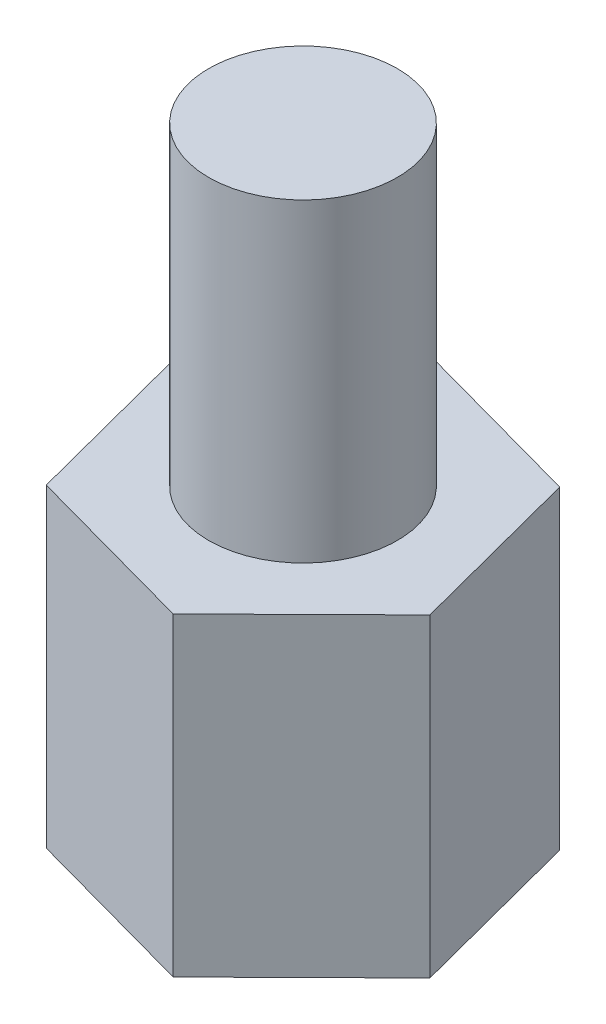
ISO-10303-21;
HEADER;
FILE_DESCRIPTION(('STEP AP214'),'2;1');
FILE_NAME('part.step','',(''),(''),'','','');
FILE_SCHEMA(('AUTOMOTIVE_DESIGN { 1 0 10303 214 1 1 1 1 }'));
ENDSEC;
DATA;
#1=APPLICATION_CONTEXT('core data for automotive mechanical design processes');
#2=APPLICATION_PROTOCOL_DEFINITION('international standard','automotive_design',2000,#1);
#3=PRODUCT_CONTEXT('',#1,'mechanical');
#4=PRODUCT('Part','Part','',(#3));
#5=PRODUCT_RELATED_PRODUCT_CATEGORY('part','',(#4));
#6=PRODUCT_DEFINITION_FORMATION('','',#4);
#7=PRODUCT_DEFINITION_CONTEXT('part definition',#1,'design');
#8=PRODUCT_DEFINITION('design','',#6,#7);
#9=PRODUCT_DEFINITION_SHAPE('','',#8);
#10=(LENGTH_UNIT() NAMED_UNIT(*) SI_UNIT(.MILLI.,.METRE.));
#11=(NAMED_UNIT(*) PLANE_ANGLE_UNIT() SI_UNIT($,.RADIAN.));
#12=(NAMED_UNIT(*) SI_UNIT($,.STERADIAN.) SOLID_ANGLE_UNIT());
#13=UNCERTAINTY_MEASURE_WITH_UNIT(LENGTH_MEASURE(1.E-05),#10,'distance_accuracy_value','');
#14=(GEOMETRIC_REPRESENTATION_CONTEXT(3) GLOBAL_UNCERTAINTY_ASSIGNED_CONTEXT((#13)) GLOBAL_UNIT_ASSIGNED_CONTEXT((#10,
#11,#12)) REPRESENTATION_CONTEXT('',''));
#15=CARTESIAN_POINT('',(0.,0.,0.));
#16=DIRECTION('',(0.,0.,1.));
#17=DIRECTION('',(1.,0.,0.));
#18=AXIS2_PLACEMENT_3D('',#15,#16,#17);
#19=CARTESIAN_POINT('',(-2.05470355532415,5.,2.02768997459466));
#20=DIRECTION('',(0.265204860797644,0.,-0.964192087609778));
#21=DIRECTION('',(-0.964192087609778,0.,-0.265204860797644));
#22=AXIS2_PLACEMENT_3D('',#19,#20,#21);
#23=PLANE('',#22);
#24=DIRECTION('',(0.964192087609778,0.,0.265204860797644));
#25=VECTOR('',#24,1.);
#26=CARTESIAN_POINT('',(-2.05470355532415,0.,2.02768997459466));
#27=LINE('',#26,#25);
#28=CARTESIAN_POINT('',(-2.05470355532415,0.,2.02768997459466));
#29=VERTEX_POINT('',#28);
#30=CARTESIAN_POINT('',(0.728679251335923,0.,2.79327046345425));
#31=VERTEX_POINT('',#30);
#32=EDGE_CURVE('E131',#29,#31,#27,.T.);
#33=ORIENTED_EDGE('',*,*,#32,.T.);
#34=DIRECTION('',(0.,-1.,0.));
#35=VECTOR('',#34,1.);
#36=CARTESIAN_POINT('',(0.728679251335923,5.,2.79327046345425));
#37=LINE('',#36,#35);
#38=CARTESIAN_POINT('',(0.728679251335923,5.,2.79327046345425));
#39=VERTEX_POINT('',#38);
#40=EDGE_CURVE('E115',#39,#31,#37,.T.);
#41=ORIENTED_EDGE('',*,*,#40,.F.);
#42=DIRECTION('',(0.964192087609778,0.,0.265204860797644));
#43=VECTOR('',#42,1.);
#44=CARTESIAN_POINT('',(-2.05470355532415,5.,2.02768997459466));
#45=LINE('',#44,#43);
#46=CARTESIAN_POINT('',(-2.05470355532415,5.,2.02768997459466));
#47=VERTEX_POINT('',#46);
#48=EDGE_CURVE('E140',#47,#39,#45,.T.);
#49=ORIENTED_EDGE('',*,*,#48,.F.);
#50=DIRECTION('',(0.,-1.,0.));
#51=VECTOR('',#50,1.);
#52=CARTESIAN_POINT('',(-2.05470355532415,5.,2.02768997459466));
#53=LINE('',#52,#51);
#54=EDGE_CURVE('E117',#47,#29,#53,.T.);
#55=ORIENTED_EDGE('',*,*,#54,.T.);
#56=EDGE_LOOP('',(#33,#41,#49,#55));
#57=FACE_BOUND('',#56,.T.);
#58=ADVANCED_FACE('F47',(#57),#23,.F.);
#59=CARTESIAN_POINT('',(0.728679251335923,5.,2.79327046345425));
#60=DIRECTION('',(-0.702412411599197,0.,-0.711770190462764));
#61=DIRECTION('',(-0.711770190462764,0.,0.702412411599197));
#62=AXIS2_PLACEMENT_3D('',#59,#60,#61);
#63=PLANE('',#62);
#64=DIRECTION('',(0.711770190462764,0.,-0.702412411599197));
#65=VECTOR('',#64,1.);
#66=CARTESIAN_POINT('',(0.728679251335923,0.,2.79327046345425));
#67=LINE('',#66,#65);
#68=CARTESIAN_POINT('',(2.78338280666007,0.,0.765580488859587));
#69=VERTEX_POINT('',#68);
#70=EDGE_CURVE('E65',#31,#69,#67,.T.);
#71=ORIENTED_EDGE('',*,*,#70,.T.);
#72=DIRECTION('',(0.,-1.,0.));
#73=VECTOR('',#72,1.);
#74=CARTESIAN_POINT('',(2.78338280666007,5.,0.765580488859587));
#75=LINE('',#74,#73);
#76=CARTESIAN_POINT('',(2.78338280666007,5.,0.765580488859587));
#77=VERTEX_POINT('',#76);
#78=EDGE_CURVE('E112',#77,#69,#75,.T.);
#79=ORIENTED_EDGE('',*,*,#78,.F.);
#80=DIRECTION('',(0.711770190462764,0.,-0.702412411599197));
#81=VECTOR('',#80,1.);
#82=CARTESIAN_POINT('',(0.728679251335923,5.,2.79327046345425));
#83=LINE('',#82,#81);
#84=EDGE_CURVE('E87',#39,#77,#83,.T.);
#85=ORIENTED_EDGE('',*,*,#84,.F.);
#86=ORIENTED_EDGE('',*,*,#40,.T.);
#87=EDGE_LOOP('',(#71,#79,#85,#86));
#88=FACE_BOUND('',#87,.T.);
#89=ADVANCED_FACE('F111',(#88),#63,.F.);
#90=CARTESIAN_POINT('',(2.78338280666007,5.,0.765580488859587));
#91=DIRECTION('',(-0.967617272396841,0.,0.252421897147014));
#92=DIRECTION('',(0.252421897147014,0.,0.967617272396841));
#93=AXIS2_PLACEMENT_3D('',#90,#91,#92);
#94=PLANE('',#93);
#95=DIRECTION('',(-0.252421897147014,0.,-0.967617272396841));
#96=VECTOR('',#95,1.);
#97=CARTESIAN_POINT('',(2.78338280666007,0.,0.765580488859587));
#98=LINE('',#97,#96);
#99=CARTESIAN_POINT('',(2.05470355532415,0.,-2.02768997459466));
#100=VERTEX_POINT('',#99);
#101=EDGE_CURVE('E108',#69,#100,#98,.T.);
#102=ORIENTED_EDGE('',*,*,#101,.T.);
#103=DIRECTION('',(0.,-1.,0.));
#104=VECTOR('',#103,1.);
#105=CARTESIAN_POINT('',(2.05470355532415,5.,-2.02768997459466));
#106=LINE('',#105,#104);
#107=CARTESIAN_POINT('',(2.05470355532415,5.,-2.02768997459466));
#108=VERTEX_POINT('',#107);
#109=EDGE_CURVE('E155',#108,#100,#106,.T.);
#110=ORIENTED_EDGE('',*,*,#109,.F.);
#111=DIRECTION('',(-0.252421897147014,0.,-0.967617272396841));
#112=VECTOR('',#111,1.);
#113=CARTESIAN_POINT('',(2.78338280666007,5.,0.765580488859587));
#114=LINE('',#113,#112);
#115=EDGE_CURVE('E120',#77,#108,#114,.T.);
#116=ORIENTED_EDGE('',*,*,#115,.F.);
#117=ORIENTED_EDGE('',*,*,#78,.T.);
#118=EDGE_LOOP('',(#102,#110,#116,#117));
#119=FACE_BOUND('',#118,.T.);
#120=ADVANCED_FACE('F119',(#119),#94,.F.);
#121=CARTESIAN_POINT('',(2.05470355532415,5.,-2.02768997459466));
#122=DIRECTION('',(-0.265204860797644,0.,0.964192087609778));
#123=DIRECTION('',(0.964192087609778,0.,0.265204860797644));
#124=AXIS2_PLACEMENT_3D('',#121,#122,#123);
#125=PLANE('',#124);
#126=DIRECTION('',(-0.964192087609778,0.,-0.265204860797644));
#127=VECTOR('',#126,1.);
#128=CARTESIAN_POINT('',(2.05470355532415,0.,-2.02768997459466));
#129=LINE('',#128,#127);
#130=CARTESIAN_POINT('',(-0.728679251335924,0.,-2.79327046345425));
#131=VERTEX_POINT('',#130);
#132=EDGE_CURVE('E121',#100,#131,#129,.T.);
#133=ORIENTED_EDGE('',*,*,#132,.T.);
#134=DIRECTION('',(0.,-1.,0.));
#135=VECTOR('',#134,1.);
#136=CARTESIAN_POINT('',(-0.728679251335924,5.,-2.79327046345425));
#137=LINE('',#136,#135);
#138=CARTESIAN_POINT('',(-0.728679251335924,5.,-2.79327046345425));
#139=VERTEX_POINT('',#138);
#140=EDGE_CURVE('E149',#139,#131,#137,.T.);
#141=ORIENTED_EDGE('',*,*,#140,.F.);
#142=DIRECTION('',(-0.964192087609778,0.,-0.265204860797644));
#143=VECTOR('',#142,1.);
#144=CARTESIAN_POINT('',(2.05470355532415,5.,-2.02768997459466));
#145=LINE('',#144,#143);
#146=EDGE_CURVE('E136',#108,#139,#145,.T.);
#147=ORIENTED_EDGE('',*,*,#146,.F.);
#148=ORIENTED_EDGE('',*,*,#109,.T.);
#149=EDGE_LOOP('',(#133,#141,#147,#148));
#150=FACE_BOUND('',#149,.T.);
#151=ADVANCED_FACE('F161',(#150),#125,.F.);
#152=CARTESIAN_POINT('',(-0.728679251335924,5.,-2.79327046345425));
#153=DIRECTION('',(0.702412411599197,0.,0.711770190462765));
#154=DIRECTION('',(0.711770190462765,0.,-0.702412411599197));
#155=AXIS2_PLACEMENT_3D('',#152,#153,#154);
#156=PLANE('',#155);
#157=DIRECTION('',(-0.711770190462765,0.,0.702412411599197));
#158=VECTOR('',#157,1.);
#159=CARTESIAN_POINT('',(-0.728679251335924,0.,-2.79327046345425));
#160=LINE('',#159,#158);
#161=CARTESIAN_POINT('',(-2.78338280666007,0.,-0.765580488859588));
#162=VERTEX_POINT('',#161);
#163=EDGE_CURVE('E154',#131,#162,#160,.T.);
#164=ORIENTED_EDGE('',*,*,#163,.T.);
#165=DIRECTION('',(0.,-1.,0.));
#166=VECTOR('',#165,1.);
#167=CARTESIAN_POINT('',(-2.78338280666007,5.,-0.765580488859588));
#168=LINE('',#167,#166);
#169=CARTESIAN_POINT('',(-2.78338280666007,5.,-0.765580488859588));
#170=VERTEX_POINT('',#169);
#171=EDGE_CURVE('E143',#170,#162,#168,.T.);
#172=ORIENTED_EDGE('',*,*,#171,.F.);
#173=DIRECTION('',(-0.711770190462765,0.,0.702412411599197));
#174=VECTOR('',#173,1.);
#175=CARTESIAN_POINT('',(-0.728679251335924,5.,-2.79327046345425));
#176=LINE('',#175,#174);
#177=EDGE_CURVE('E134',#139,#170,#176,.T.);
#178=ORIENTED_EDGE('',*,*,#177,.F.);
#179=ORIENTED_EDGE('',*,*,#140,.T.);
#180=EDGE_LOOP('',(#164,#172,#178,#179));
#181=FACE_BOUND('',#180,.T.);
#182=ADVANCED_FACE('F163',(#181),#156,.F.);
#183=CARTESIAN_POINT('',(-2.78338280666007,5.,-0.765580488859588));
#184=DIRECTION('',(0.967617272396841,0.,-0.252421897147014));
#185=DIRECTION('',(-0.252421897147014,0.,-0.967617272396841));
#186=AXIS2_PLACEMENT_3D('',#183,#184,#185);
#187=PLANE('',#186);
#188=DIRECTION('',(0.252421897147014,0.,0.967617272396841));
#189=VECTOR('',#188,1.);
#190=CARTESIAN_POINT('',(-2.78338280666007,0.,-0.765580488859588));
#191=LINE('',#190,#189);
#192=EDGE_CURVE('E96',#162,#29,#191,.T.);
#193=ORIENTED_EDGE('',*,*,#192,.T.);
#194=ORIENTED_EDGE('',*,*,#54,.F.);
#195=DIRECTION('',(0.252421897147014,0.,0.967617272396841));
#196=VECTOR('',#195,1.);
#197=CARTESIAN_POINT('',(-2.78338280666007,5.,-0.765580488859588));
#198=LINE('',#197,#196);
#199=EDGE_CURVE('E57',#170,#47,#198,.T.);
#200=ORIENTED_EDGE('',*,*,#199,.F.);
#201=ORIENTED_EDGE('',*,*,#171,.T.);
#202=EDGE_LOOP('',(#193,#194,#200,#201));
#203=FACE_BOUND('',#202,.T.);
#204=ADVANCED_FACE('F165',(#203),#187,.F.);
#205=CARTESIAN_POINT('',(0.,5.,0.));
#206=DIRECTION('',(0.,1.,0.));
#207=DIRECTION('',(0.,0.,1.));
#208=AXIS2_PLACEMENT_3D('',#205,#206,#207);
#209=PLANE('',#208);
#210=CARTESIAN_POINT('',(0.,5.,0.));
#211=DIRECTION('',(0.,-1.,0.));
#212=DIRECTION('',(0.,0.,-1.));
#213=AXIS2_PLACEMENT_3D('',#210,#211,#212);
#214=CIRCLE('',#213,1.5);
#215=CARTESIAN_POINT('',(0.,5.,-1.5));
#216=VERTEX_POINT('',#215);
#217=EDGE_CURVE('E51',#216,#216,#214,.T.);
#218=ORIENTED_EDGE('',*,*,#217,.T.);
#219=EDGE_LOOP('',(#218));
#220=FACE_BOUND('',#219,.T.);
#221=ORIENTED_EDGE('',*,*,#48,.T.);
#222=ORIENTED_EDGE('',*,*,#84,.T.);
#223=ORIENTED_EDGE('',*,*,#115,.T.);
#224=ORIENTED_EDGE('',*,*,#146,.T.);
#225=ORIENTED_EDGE('',*,*,#177,.T.);
#226=ORIENTED_EDGE('',*,*,#199,.T.);
#227=EDGE_LOOP('',(#221,#222,#223,#224,#225,#226));
#228=FACE_BOUND('',#227,.T.);
#229=ADVANCED_FACE('F166',(#220,#228),#209,.T.);
#230=CARTESIAN_POINT('',(0.,0.,0.));
#231=DIRECTION('',(0.,1.,0.));
#232=DIRECTION('',(0.,0.,1.));
#233=AXIS2_PLACEMENT_3D('',#230,#231,#232);
#234=PLANE('',#233);
#235=CARTESIAN_POINT('',(0.,0.,0.));
#236=DIRECTION('',(0.,-1.,0.));
#237=DIRECTION('',(0.,0.,-1.));
#238=AXIS2_PLACEMENT_3D('',#235,#236,#237);
#239=CIRCLE('',#238,1.5);
#240=CARTESIAN_POINT('',(0.,0.,-1.5));
#241=VERTEX_POINT('',#240);
#242=EDGE_CURVE('E12',#241,#241,#239,.T.);
#243=ORIENTED_EDGE('',*,*,#242,.F.);
#244=EDGE_LOOP('',(#243));
#245=FACE_BOUND('',#244,.T.);
#246=ORIENTED_EDGE('',*,*,#32,.F.);
#247=ORIENTED_EDGE('',*,*,#192,.F.);
#248=ORIENTED_EDGE('',*,*,#163,.F.);
#249=ORIENTED_EDGE('',*,*,#132,.F.);
#250=ORIENTED_EDGE('',*,*,#101,.F.);
#251=ORIENTED_EDGE('',*,*,#70,.F.);
#252=EDGE_LOOP('',(#246,#247,#248,#249,#250,#251));
#253=FACE_BOUND('',#252,.T.);
#254=ADVANCED_FACE('F124',(#245,#253),#234,.F.);
#255=CARTESIAN_POINT('',(0.,5.,0.));
#256=DIRECTION('',(0.,-1.,0.));
#257=DIRECTION('',(0.,0.,-1.));
#258=AXIS2_PLACEMENT_3D('',#255,#256,#257);
#259=CYLINDRICAL_SURFACE('',#258,1.5);
#260=ORIENTED_EDGE('',*,*,#217,.F.);
#261=EDGE_LOOP('',(#260));
#262=FACE_BOUND('',#261,.T.);
#263=ORIENTED_EDGE('',*,*,#242,.T.);
#264=EDGE_LOOP('',(#263));
#265=FACE_BOUND('',#264,.T.);
#266=ADVANCED_FACE('F49',(#262,#265),#259,.F.);
#267=CLOSED_SHELL('',(#58,#89,#120,#151,#182,#204,#229,#254,#266));
#268=MANIFOLD_SOLID_BREP('B2',#267);
#269=CARTESIAN_POINT('',(0.,10.,0.));
#270=DIRECTION('',(0.,1.,0.));
#271=DIRECTION('',(0.,0.,1.));
#272=AXIS2_PLACEMENT_3D('',#269,#270,#271);
#273=PLANE('',#272);
#274=CARTESIAN_POINT('',(0.,10.,0.));
#275=DIRECTION('',(0.,1.,0.));
#276=DIRECTION('',(0.,0.,1.));
#277=AXIS2_PLACEMENT_3D('',#274,#275,#276);
#278=CIRCLE('',#277,1.5);
#279=CARTESIAN_POINT('',(0.,10.,1.5));
#280=VERTEX_POINT('',#279);
#281=EDGE_CURVE('E46',#280,#280,#278,.T.);
#282=ORIENTED_EDGE('',*,*,#281,.T.);
#283=EDGE_LOOP('',(#282));
#284=FACE_BOUND('',#283,.T.);
#285=ADVANCED_FACE('F246',(#284),#273,.T.);
#286=CARTESIAN_POINT('',(0.,10.,0.));
#287=DIRECTION('',(0.,-1.,0.));
#288=DIRECTION('',(0.,0.,-1.));
#289=AXIS2_PLACEMENT_3D('',#286,#287,#288);
#290=CYLINDRICAL_SURFACE('',#289,1.5);
#291=ORIENTED_EDGE('',*,*,#281,.F.);
#292=EDGE_LOOP('',(#291));
#293=FACE_BOUND('',#292,.T.);
#294=CARTESIAN_POINT('',(0.,5.,0.));
#295=DIRECTION('',(0.,-1.,0.));
#296=DIRECTION('',(0.,0.,-1.));
#297=AXIS2_PLACEMENT_3D('',#294,#295,#296);
#298=CIRCLE('',#297,1.5);
#299=CARTESIAN_POINT('',(0.,5.,-1.5));
#300=VERTEX_POINT('',#299);
#301=EDGE_CURVE('E253',#300,#300,#298,.T.);
#302=ORIENTED_EDGE('',*,*,#301,.F.);
#303=EDGE_LOOP('',(#302));
#304=FACE_BOUND('',#303,.T.);
#305=ADVANCED_FACE('F248',(#293,#304),#290,.T.);
#306=CARTESIAN_POINT('',(0.,5.,0.));
#307=DIRECTION('',(0.,-1.,0.));
#308=DIRECTION('',(0.,0.,-1.));
#309=AXIS2_PLACEMENT_3D('',#306,#307,#308);
#310=PLANE('',#309);
#311=ORIENTED_EDGE('',*,*,#301,.T.);
#312=EDGE_LOOP('',(#311));
#313=FACE_BOUND('',#312,.T.);
#314=ADVANCED_FACE('F259',(#313),#310,.T.);
#315=CLOSED_SHELL('',(#285,#305,#314));
#316=MANIFOLD_SOLID_BREP('B6',#315);
#317=ADVANCED_BREP_SHAPE_REPRESENTATION('',(#18,#268,#316),#14);
#318=SHAPE_DEFINITION_REPRESENTATION(#9,#317);
ENDSEC;
END-ISO-10303-21;
